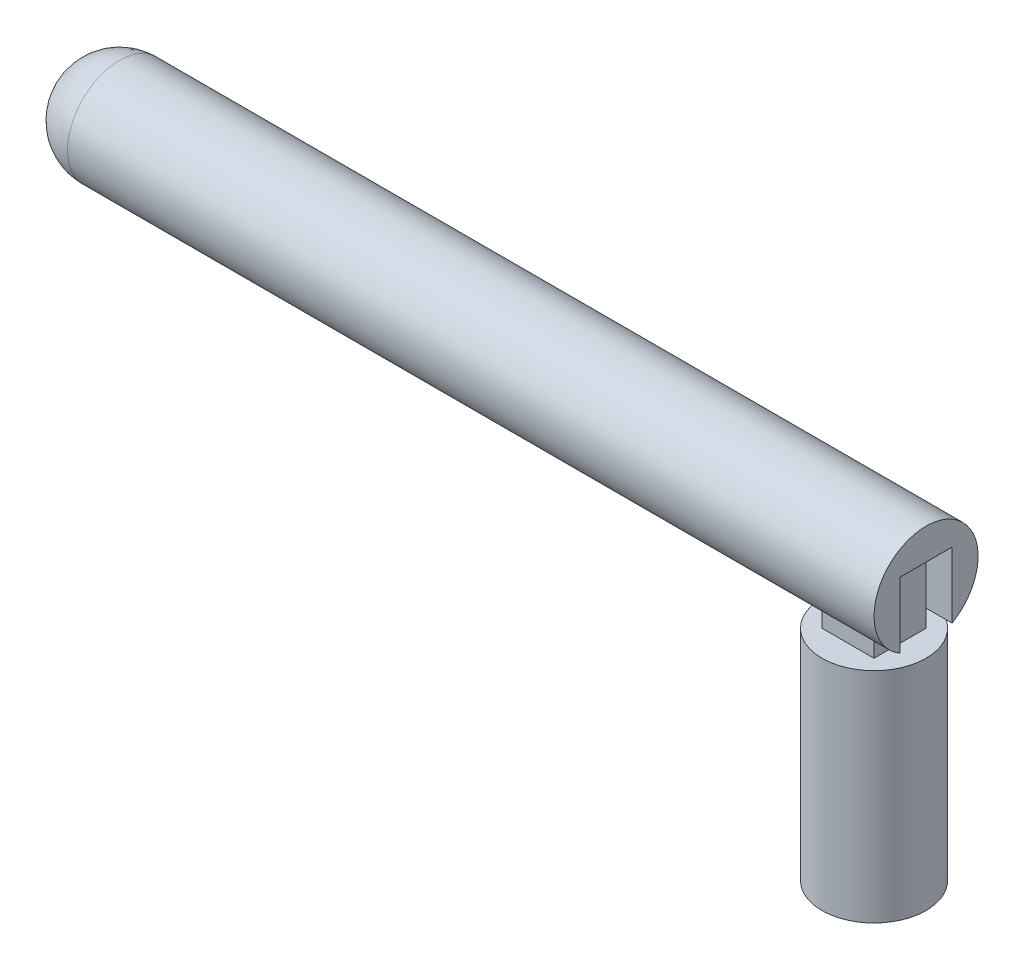
ISO-10303-21;
HEADER;
FILE_DESCRIPTION(('STEP AP214'),'2;1');
FILE_NAME('part.step','',(''),(''),'','','');
FILE_SCHEMA(('AUTOMOTIVE_DESIGN { 1 0 10303 214 1 1 1 1 }'));
ENDSEC;
DATA;
#1=APPLICATION_CONTEXT('core data for automotive mechanical design processes');
#2=APPLICATION_PROTOCOL_DEFINITION('international standard','automotive_design',2000,#1);
#3=PRODUCT_CONTEXT('',#1,'mechanical');
#4=PRODUCT('Part','Part','',(#3));
#5=PRODUCT_RELATED_PRODUCT_CATEGORY('part','',(#4));
#6=PRODUCT_DEFINITION_FORMATION('','',#4);
#7=PRODUCT_DEFINITION_CONTEXT('part definition',#1,'design');
#8=PRODUCT_DEFINITION('design','',#6,#7);
#9=PRODUCT_DEFINITION_SHAPE('','',#8);
#10=(LENGTH_UNIT() NAMED_UNIT(*) SI_UNIT(.MILLI.,.METRE.));
#11=(NAMED_UNIT(*) PLANE_ANGLE_UNIT() SI_UNIT($,.RADIAN.));
#12=(NAMED_UNIT(*) SI_UNIT($,.STERADIAN.) SOLID_ANGLE_UNIT());
#13=UNCERTAINTY_MEASURE_WITH_UNIT(LENGTH_MEASURE(1.E-05),#10,'distance_accuracy_value','');
#14=(GEOMETRIC_REPRESENTATION_CONTEXT(3) GLOBAL_UNCERTAINTY_ASSIGNED_CONTEXT((#13)) GLOBAL_UNIT_ASSIGNED_CONTEXT((#10,
#11,#12)) REPRESENTATION_CONTEXT('',''));
#15=CARTESIAN_POINT('',(0.,0.,0.));
#16=DIRECTION('',(0.,0.,1.));
#17=DIRECTION('',(1.,0.,0.));
#18=AXIS2_PLACEMENT_3D('',#15,#16,#17);
#19=CARTESIAN_POINT('',(0.,0.,0.));
#20=DIRECTION('',(0.,1.,0.));
#21=DIRECTION('',(0.,0.,1.));
#22=AXIS2_PLACEMENT_3D('',#19,#20,#21);
#23=PLANE('',#22);
#24=CARTESIAN_POINT('',(0.,0.,0.));
#25=DIRECTION('',(0.,-1.,0.));
#26=DIRECTION('',(0.,0.,-1.));
#27=AXIS2_PLACEMENT_3D('',#24,#25,#26);
#28=CIRCLE('',#27,5.);
#29=CARTESIAN_POINT('',(0.,0.,-5.));
#30=VERTEX_POINT('',#29);
#31=EDGE_CURVE('E20',#30,#30,#28,.F.);
#32=ORIENTED_EDGE('',*,*,#31,.F.);
#33=EDGE_LOOP('',(#32));
#34=FACE_BOUND('',#33,.T.);
#35=ADVANCED_FACE('F17',(#34),#23,.F.);
#36=CARTESIAN_POINT('',(0.,21.,0.));
#37=DIRECTION('',(0.,-1.,0.));
#38=DIRECTION('',(0.,0.,-1.));
#39=AXIS2_PLACEMENT_3D('',#36,#37,#38);
#40=CYLINDRICAL_SURFACE('',#39,5.);
#41=ORIENTED_EDGE('',*,*,#31,.T.);
#42=EDGE_LOOP('',(#41));
#43=FACE_BOUND('',#42,.T.);
#44=CARTESIAN_POINT('',(0.,21.,0.));
#45=DIRECTION('',(0.,-1.,0.));
#46=DIRECTION('',(0.,0.,-1.));
#47=AXIS2_PLACEMENT_3D('',#44,#45,#46);
#48=CIRCLE('',#47,5.);
#49=CARTESIAN_POINT('',(0.,21.,-5.));
#50=VERTEX_POINT('',#49);
#51=EDGE_CURVE('E112',#50,#50,#48,.F.);
#52=ORIENTED_EDGE('',*,*,#51,.F.);
#53=EDGE_LOOP('',(#52));
#54=FACE_BOUND('',#53,.T.);
#55=ADVANCED_FACE('F122',(#43,#54),#40,.T.);
#56=CARTESIAN_POINT('',(0.,21.,0.));
#57=DIRECTION('',(0.,1.,0.));
#58=DIRECTION('',(0.,0.,1.));
#59=AXIS2_PLACEMENT_3D('',#56,#57,#58);
#60=PLANE('',#59);
#61=DIRECTION('',(-1.,0.,0.));
#62=VECTOR('',#61,1.);
#63=CARTESIAN_POINT('',(-2.5,21.,2.5));
#64=LINE('',#63,#62);
#65=CARTESIAN_POINT('',(2.5,21.,2.5));
#66=VERTEX_POINT('',#65);
#67=CARTESIAN_POINT('',(-2.5,21.,2.5));
#68=VERTEX_POINT('',#67);
#69=EDGE_CURVE('E89',#66,#68,#64,.T.);
#70=ORIENTED_EDGE('',*,*,#69,.T.);
#71=DIRECTION('',(0.,0.,-1.));
#72=VECTOR('',#71,1.);
#73=CARTESIAN_POINT('',(-2.5,21.,-2.5));
#74=LINE('',#73,#72);
#75=CARTESIAN_POINT('',(-2.5,21.,-2.5));
#76=VERTEX_POINT('',#75);
#77=EDGE_CURVE('E85',#68,#76,#74,.T.);
#78=ORIENTED_EDGE('',*,*,#77,.T.);
#79=DIRECTION('',(1.,0.,0.));
#80=VECTOR('',#79,1.);
#81=CARTESIAN_POINT('',(2.5,21.,-2.5));
#82=LINE('',#81,#80);
#83=CARTESIAN_POINT('',(2.5,21.,-2.5));
#84=VERTEX_POINT('',#83);
#85=EDGE_CURVE('E180',#76,#84,#82,.T.);
#86=ORIENTED_EDGE('',*,*,#85,.T.);
#87=DIRECTION('',(0.,0.,1.));
#88=VECTOR('',#87,1.);
#89=CARTESIAN_POINT('',(2.5,21.,0.));
#90=LINE('',#89,#88);
#91=EDGE_CURVE('E114',#84,#66,#90,.T.);
#92=ORIENTED_EDGE('',*,*,#91,.T.);
#93=EDGE_LOOP('',(#70,#78,#86,#92));
#94=FACE_BOUND('',#93,.T.);
#95=ORIENTED_EDGE('',*,*,#51,.T.);
#96=EDGE_LOOP('',(#95));
#97=FACE_BOUND('',#96,.T.);
#98=ADVANCED_FACE('F130',(#94,#97),#60,.T.);
#99=CARTESIAN_POINT('',(2.5,27.,0.));
#100=DIRECTION('',(-1.,0.,0.));
#101=DIRECTION('',(0.,0.,1.));
#102=AXIS2_PLACEMENT_3D('',#99,#100,#101);
#103=PLANE('',#102);
#104=DIRECTION('',(0.,1.,0.));
#105=VECTOR('',#104,1.);
#106=CARTESIAN_POINT('',(2.5,29.,-2.5));
#107=LINE('',#106,#105);
#108=CARTESIAN_POINT('',(2.5,29.,-2.5));
#109=VERTEX_POINT('',#108);
#110=CARTESIAN_POINT('',(2.5,22.6698729810778,-2.5));
#111=VERTEX_POINT('',#110);
#112=EDGE_CURVE('E186',#109,#111,#107,.F.);
#113=ORIENTED_EDGE('',*,*,#112,.F.);
#114=DIRECTION('',(0.,0.,-1.));
#115=VECTOR('',#114,1.);
#116=CARTESIAN_POINT('',(2.5,29.,2.5));
#117=LINE('',#116,#115);
#118=CARTESIAN_POINT('',(2.5,29.,2.5));
#119=VERTEX_POINT('',#118);
#120=EDGE_CURVE('E117',#119,#109,#117,.T.);
#121=ORIENTED_EDGE('',*,*,#120,.F.);
#122=DIRECTION('',(0.,1.,0.));
#123=VECTOR('',#122,1.);
#124=CARTESIAN_POINT('',(2.5,21.,2.5));
#125=LINE('',#124,#123);
#126=CARTESIAN_POINT('',(2.5,22.6698729810778,2.5));
#127=VERTEX_POINT('',#126);
#128=EDGE_CURVE('E88',#127,#119,#125,.T.);
#129=ORIENTED_EDGE('',*,*,#128,.F.);
#130=DIRECTION('',(0.,1.,0.));
#131=VECTOR('',#130,1.);
#132=CARTESIAN_POINT('',(2.5,27.,2.5));
#133=LINE('',#132,#131);
#134=EDGE_CURVE('E96',#127,#66,#133,.F.);
#135=ORIENTED_EDGE('',*,*,#134,.T.);
#136=ORIENTED_EDGE('',*,*,#91,.F.);
#137=DIRECTION('',(0.,1.,0.));
#138=VECTOR('',#137,1.);
#139=CARTESIAN_POINT('',(2.5,27.,-2.5));
#140=LINE('',#139,#138);
#141=EDGE_CURVE('E178',#84,#111,#140,.T.);
#142=ORIENTED_EDGE('',*,*,#141,.T.);
#143=EDGE_LOOP('',(#113,#121,#129,#135,#136,#142));
#144=FACE_BOUND('',#143,.T.);
#145=ADVANCED_FACE('F223',(#144),#103,.F.);
#146=CARTESIAN_POINT('',(5.001,29.,2.5));
#147=DIRECTION('',(0.,-1.,0.));
#148=DIRECTION('',(0.,0.,-1.));
#149=AXIS2_PLACEMENT_3D('',#146,#147,#148);
#150=PLANE('',#149);
#151=ORIENTED_EDGE('',*,*,#120,.T.);
#152=DIRECTION('',(1.,0.,0.));
#153=VECTOR('',#152,1.);
#154=CARTESIAN_POINT('',(5.001,29.,-2.5));
#155=LINE('',#154,#153);
#156=CARTESIAN_POINT('',(5.,29.,-2.5));
#157=VERTEX_POINT('',#156);
#158=EDGE_CURVE('E189',#157,#109,#155,.F.);
#159=ORIENTED_EDGE('',*,*,#158,.F.);
#160=DIRECTION('',(0.,0.,-1.));
#161=VECTOR('',#160,1.);
#162=CARTESIAN_POINT('',(5.,29.,0.));
#163=LINE('',#162,#161);
#164=CARTESIAN_POINT('',(5.,29.,2.5));
#165=VERTEX_POINT('',#164);
#166=EDGE_CURVE('E154',#165,#157,#163,.T.);
#167=ORIENTED_EDGE('',*,*,#166,.F.);
#168=DIRECTION('',(-1.,0.,0.));
#169=VECTOR('',#168,1.);
#170=CARTESIAN_POINT('',(5.001,29.,2.5));
#171=LINE('',#170,#169);
#172=EDGE_CURVE('E162',#119,#165,#171,.F.);
#173=ORIENTED_EDGE('',*,*,#172,.F.);
#174=EDGE_LOOP('',(#151,#159,#167,#173));
#175=FACE_BOUND('',#174,.T.);
#176=ADVANCED_FACE('F231',(#175),#150,.T.);
#177=CARTESIAN_POINT('',(5.001,29.,-2.5));
#178=DIRECTION('',(0.,0.,1.));
#179=DIRECTION('',(1.,0.,0.));
#180=AXIS2_PLACEMENT_3D('',#177,#178,#179);
#181=PLANE('',#180);
#182=ORIENTED_EDGE('',*,*,#112,.T.);
#183=DIRECTION('',(-1.,0.,0.));
#184=VECTOR('',#183,1.);
#185=CARTESIAN_POINT('',(5.,22.6698729810778,-2.5));
#186=LINE('',#185,#184);
#187=CARTESIAN_POINT('',(5.,22.6698729810778,-2.5));
#188=VERTEX_POINT('',#187);
#189=EDGE_CURVE('E108',#188,#111,#186,.T.);
#190=ORIENTED_EDGE('',*,*,#189,.F.);
#191=DIRECTION('',(0.,1.,0.));
#192=VECTOR('',#191,1.);
#193=CARTESIAN_POINT('',(5.,27.,-2.5));
#194=LINE('',#193,#192);
#195=EDGE_CURVE('E149',#157,#188,#194,.F.);
#196=ORIENTED_EDGE('',*,*,#195,.F.);
#197=ORIENTED_EDGE('',*,*,#158,.T.);
#198=EDGE_LOOP('',(#182,#190,#196,#197));
#199=FACE_BOUND('',#198,.T.);
#200=ADVANCED_FACE('F228',(#199),#181,.T.);
#201=CARTESIAN_POINT('',(2.5,27.,-2.5));
#202=DIRECTION('',(0.,0.,1.));
#203=DIRECTION('',(1.,0.,0.));
#204=AXIS2_PLACEMENT_3D('',#201,#202,#203);
#205=PLANE('',#204);
#206=ORIENTED_EDGE('',*,*,#141,.F.);
#207=ORIENTED_EDGE('',*,*,#85,.F.);
#208=DIRECTION('',(0.,1.,0.));
#209=VECTOR('',#208,1.);
#210=CARTESIAN_POINT('',(-2.5,27.,-2.5));
#211=LINE('',#210,#209);
#212=CARTESIAN_POINT('',(-2.5,22.6698729810778,-2.5));
#213=VERTEX_POINT('',#212);
#214=EDGE_CURVE('E168',#76,#213,#211,.T.);
#215=ORIENTED_EDGE('',*,*,#214,.T.);
#216=DIRECTION('',(-1.,0.,0.));
#217=VECTOR('',#216,1.);
#218=CARTESIAN_POINT('',(5.,22.6698729810778,-2.5));
#219=LINE('',#218,#217);
#220=EDGE_CURVE('E106',#111,#213,#219,.T.);
#221=ORIENTED_EDGE('',*,*,#220,.F.);
#222=EDGE_LOOP('',(#206,#207,#215,#221));
#223=FACE_BOUND('',#222,.T.);
#224=ADVANCED_FACE('F224',(#223),#205,.F.);
#225=CARTESIAN_POINT('',(-2.5,27.,-2.5));
#226=DIRECTION('',(1.,0.,0.));
#227=DIRECTION('',(0.,0.,-1.));
#228=AXIS2_PLACEMENT_3D('',#225,#226,#227);
#229=PLANE('',#228);
#230=ORIENTED_EDGE('',*,*,#214,.F.);
#231=ORIENTED_EDGE('',*,*,#77,.F.);
#232=DIRECTION('',(0.,1.,0.));
#233=VECTOR('',#232,1.);
#234=CARTESIAN_POINT('',(-2.5,27.,2.5));
#235=LINE('',#234,#233);
#236=CARTESIAN_POINT('',(-2.5,22.6698729810778,2.5));
#237=VERTEX_POINT('',#236);
#238=EDGE_CURVE('E78',#68,#237,#235,.T.);
#239=ORIENTED_EDGE('',*,*,#238,.T.);
#240=CARTESIAN_POINT('',(-2.5,27.,0.));
#241=DIRECTION('',(-1.,0.,0.));
#242=DIRECTION('',(0.,0.,1.));
#243=AXIS2_PLACEMENT_3D('',#240,#241,#242);
#244=CIRCLE('',#243,5.);
#245=EDGE_CURVE('E83',#213,#237,#244,.T.);
#246=ORIENTED_EDGE('',*,*,#245,.F.);
#247=EDGE_LOOP('',(#230,#231,#239,#246));
#248=FACE_BOUND('',#247,.T.);
#249=ADVANCED_FACE('F81',(#248),#229,.F.);
#250=CARTESIAN_POINT('',(-2.5,27.,2.5));
#251=DIRECTION('',(0.,0.,-1.));
#252=DIRECTION('',(-1.,0.,0.));
#253=AXIS2_PLACEMENT_3D('',#250,#251,#252);
#254=PLANE('',#253);
#255=ORIENTED_EDGE('',*,*,#238,.F.);
#256=ORIENTED_EDGE('',*,*,#69,.F.);
#257=ORIENTED_EDGE('',*,*,#134,.F.);
#258=DIRECTION('',(-1.,0.,0.));
#259=VECTOR('',#258,1.);
#260=CARTESIAN_POINT('',(5.,22.6698729810778,2.5));
#261=LINE('',#260,#259);
#262=EDGE_CURVE('E93',#237,#127,#261,.F.);
#263=ORIENTED_EDGE('',*,*,#262,.F.);
#264=EDGE_LOOP('',(#255,#256,#257,#263));
#265=FACE_BOUND('',#264,.T.);
#266=ADVANCED_FACE('F94',(#265),#254,.F.);
#267=CARTESIAN_POINT('',(5.001,21.,2.5));
#268=DIRECTION('',(0.,0.,-1.));
#269=DIRECTION('',(-1.,0.,0.));
#270=AXIS2_PLACEMENT_3D('',#267,#268,#269);
#271=PLANE('',#270);
#272=DIRECTION('',(0.,1.,0.));
#273=VECTOR('',#272,1.);
#274=CARTESIAN_POINT('',(5.,27.,2.5));
#275=LINE('',#274,#273);
#276=CARTESIAN_POINT('',(5.,22.6698729810778,2.5));
#277=VERTEX_POINT('',#276);
#278=EDGE_CURVE('E146',#277,#165,#275,.T.);
#279=ORIENTED_EDGE('',*,*,#278,.F.);
#280=DIRECTION('',(-1.,0.,0.));
#281=VECTOR('',#280,1.);
#282=CARTESIAN_POINT('',(5.,22.6698729810778,2.5));
#283=LINE('',#282,#281);
#284=EDGE_CURVE('E100',#127,#277,#283,.F.);
#285=ORIENTED_EDGE('',*,*,#284,.F.);
#286=ORIENTED_EDGE('',*,*,#128,.T.);
#287=ORIENTED_EDGE('',*,*,#172,.T.);
#288=EDGE_LOOP('',(#279,#285,#286,#287));
#289=FACE_BOUND('',#288,.T.);
#290=ADVANCED_FACE('F234',(#289),#271,.T.);
#291=CARTESIAN_POINT('',(5.,27.,0.));
#292=DIRECTION('',(1.,0.,0.));
#293=DIRECTION('',(0.,0.,-1.));
#294=AXIS2_PLACEMENT_3D('',#291,#292,#293);
#295=PLANE('',#294);
#296=CARTESIAN_POINT('',(5.,27.,0.));
#297=DIRECTION('',(-1.,0.,0.));
#298=DIRECTION('',(0.,0.,1.));
#299=AXIS2_PLACEMENT_3D('',#296,#297,#298);
#300=CIRCLE('',#299,5.);
#301=EDGE_CURVE('E26',#277,#188,#300,.T.);
#302=ORIENTED_EDGE('',*,*,#301,.F.);
#303=ORIENTED_EDGE('',*,*,#278,.T.);
#304=ORIENTED_EDGE('',*,*,#166,.T.);
#305=ORIENTED_EDGE('',*,*,#195,.T.);
#306=EDGE_LOOP('',(#302,#303,#304,#305));
#307=FACE_BOUND('',#306,.T.);
#308=ADVANCED_FACE('F138',(#307),#295,.T.);
#309=CARTESIAN_POINT('',(-72.5,27.,0.));
#310=DIRECTION('',(0.,0.,-1.));
#311=DIRECTION('',(-1.,0.,0.));
#312=AXIS2_PLACEMENT_3D('',#309,#310,#311);
#313=SPHERICAL_SURFACE('',#312,5.);
#314=CARTESIAN_POINT('',(-72.5,27.,0.));
#315=DIRECTION('',(-1.,0.,0.));
#316=DIRECTION('',(0.,0.,1.));
#317=AXIS2_PLACEMENT_3D('',#314,#315,#316);
#318=CIRCLE('',#317,5.);
#319=CARTESIAN_POINT('',(-72.5,27.,-5.));
#320=VERTEX_POINT('',#319);
#321=CARTESIAN_POINT('',(-72.5,27.,5.));
#322=VERTEX_POINT('',#321);
#323=EDGE_CURVE('E11',#320,#322,#318,.F.);
#324=ORIENTED_EDGE('',*,*,#323,.F.);
#325=CARTESIAN_POINT('',(-72.5,27.,0.));
#326=DIRECTION('',(-1.,0.,0.));
#327=DIRECTION('',(0.,0.,1.));
#328=AXIS2_PLACEMENT_3D('',#325,#326,#327);
#329=CIRCLE('',#328,5.);
#330=EDGE_CURVE('E34',#322,#320,#329,.F.);
#331=ORIENTED_EDGE('',*,*,#330,.F.);
#332=EDGE_LOOP('',(#324,#331));
#333=FACE_BOUND('',#332,.T.);
#334=ADVANCED_FACE('F132',(#333),#313,.T.);
#335=CARTESIAN_POINT('',(5.,27.,0.));
#336=DIRECTION('',(-1.,0.,0.));
#337=DIRECTION('',(0.,0.,1.));
#338=AXIS2_PLACEMENT_3D('',#335,#336,#337);
#339=CYLINDRICAL_SURFACE('',#338,5.);
#340=ORIENTED_EDGE('',*,*,#330,.T.);
#341=ORIENTED_EDGE('',*,*,#323,.T.);
#342=EDGE_LOOP('',(#340,#341));
#343=FACE_BOUND('',#342,.T.);
#344=ORIENTED_EDGE('',*,*,#301,.T.);
#345=ORIENTED_EDGE('',*,*,#189,.T.);
#346=ORIENTED_EDGE('',*,*,#220,.T.);
#347=ORIENTED_EDGE('',*,*,#245,.T.);
#348=ORIENTED_EDGE('',*,*,#262,.T.);
#349=ORIENTED_EDGE('',*,*,#284,.T.);
#350=EDGE_LOOP('',(#344,#345,#346,#347,#348,#349));
#351=FACE_BOUND('',#350,.T.);
#352=ADVANCED_FACE('F103',(#343,#351),#339,.T.);
#353=CLOSED_SHELL('',(#35,#55,#98,#145,#176,#200,#224,#249,#266,#290,#308,#334,#352));
#354=MANIFOLD_SOLID_BREP('B1',#353);
#355=ADVANCED_BREP_SHAPE_REPRESENTATION('',(#18,#354),#14);
#356=SHAPE_DEFINITION_REPRESENTATION(#9,#355);
ENDSEC;
END-ISO-10303-21;
